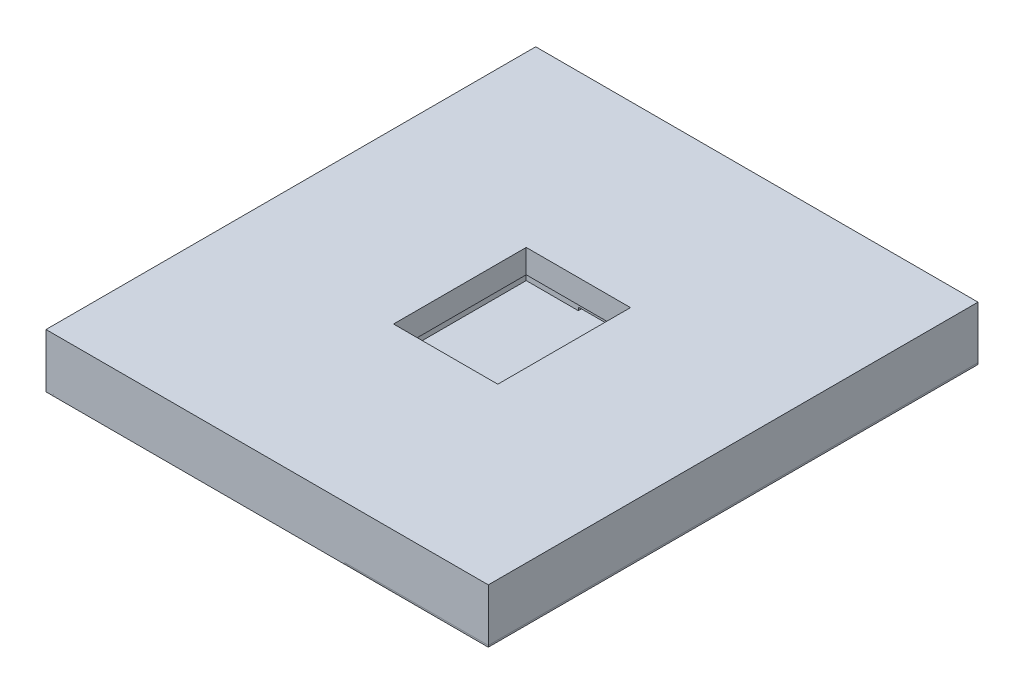
ISO-10303-21;
HEADER;
FILE_DESCRIPTION(('STEP AP214'),'2;1');
FILE_NAME('part.step','',(''),(''),'','','');
FILE_SCHEMA(('AUTOMOTIVE_DESIGN { 1 0 10303 214 1 1 1 1 }'));
ENDSEC;
DATA;
#1=APPLICATION_CONTEXT('core data for automotive mechanical design processes');
#2=APPLICATION_PROTOCOL_DEFINITION('international standard','automotive_design',2000,#1);
#3=PRODUCT_CONTEXT('',#1,'mechanical');
#4=PRODUCT('Part','Part','',(#3));
#5=PRODUCT_RELATED_PRODUCT_CATEGORY('part','',(#4));
#6=PRODUCT_DEFINITION_FORMATION('','',#4);
#7=PRODUCT_DEFINITION_CONTEXT('part definition',#1,'design');
#8=PRODUCT_DEFINITION('design','',#6,#7);
#9=PRODUCT_DEFINITION_SHAPE('','',#8);
#10=(LENGTH_UNIT() NAMED_UNIT(*) SI_UNIT(.MILLI.,.METRE.));
#11=(NAMED_UNIT(*) PLANE_ANGLE_UNIT() SI_UNIT($,.RADIAN.));
#12=(NAMED_UNIT(*) SI_UNIT($,.STERADIAN.) SOLID_ANGLE_UNIT());
#13=UNCERTAINTY_MEASURE_WITH_UNIT(LENGTH_MEASURE(1.E-05),#10,'distance_accuracy_value','');
#14=(GEOMETRIC_REPRESENTATION_CONTEXT(3) GLOBAL_UNCERTAINTY_ASSIGNED_CONTEXT((#13)) GLOBAL_UNIT_ASSIGNED_CONTEXT((#10,
#11,#12)) REPRESENTATION_CONTEXT('',''));
#15=CARTESIAN_POINT('',(0.,0.,0.));
#16=DIRECTION('',(0.,0.,1.));
#17=DIRECTION('',(1.,0.,0.));
#18=AXIS2_PLACEMENT_3D('',#15,#16,#17);
#19=CARTESIAN_POINT('',(0.,6.49,0.));
#20=DIRECTION('',(0.,1.,0.));
#21=DIRECTION('',(0.,0.,1.));
#22=AXIS2_PLACEMENT_3D('',#19,#20,#21);
#23=PLANE('',#22);
#24=DIRECTION('',(0.,0.,1.));
#25=VECTOR('',#24,1.);
#26=CARTESIAN_POINT('',(8.,6.49,-32.3));
#27=LINE('',#26,#25);
#28=CARTESIAN_POINT('',(8.,6.49,-26.5));
#29=VERTEX_POINT('',#28);
#30=CARTESIAN_POINT('',(8.,6.49,-25.));
#31=VERTEX_POINT('',#30);
#32=EDGE_CURVE('E607',#29,#31,#27,.T.);
#33=ORIENTED_EDGE('',*,*,#32,.T.);
#34=DIRECTION('',(1.,0.,0.));
#35=VECTOR('',#34,1.);
#36=CARTESIAN_POINT('',(0.,6.49,-25.));
#37=LINE('',#36,#35);
#38=CARTESIAN_POINT('',(-3.,6.49,-25.));
#39=VERTEX_POINT('',#38);
#40=EDGE_CURVE('E400',#39,#31,#37,.T.);
#41=ORIENTED_EDGE('',*,*,#40,.F.);
#42=DIRECTION('',(0.,0.,1.));
#43=VECTOR('',#42,1.);
#44=CARTESIAN_POINT('',(-3.,6.49,0.));
#45=LINE('',#44,#43);
#46=CARTESIAN_POINT('',(-3.,6.49,3.));
#47=VERTEX_POINT('',#46);
#48=EDGE_CURVE('E395',#39,#47,#45,.T.);
#49=ORIENTED_EDGE('',*,*,#48,.T.);
#50=DIRECTION('',(1.,0.,0.));
#51=VECTOR('',#50,1.);
#52=CARTESIAN_POINT('',(0.,6.49,3.));
#53=LINE('',#52,#51);
#54=CARTESIAN_POINT('',(22.,6.49,3.));
#55=VERTEX_POINT('',#54);
#56=EDGE_CURVE('E405',#47,#55,#53,.T.);
#57=ORIENTED_EDGE('',*,*,#56,.T.);
#58=DIRECTION('',(0.,0.,1.));
#59=VECTOR('',#58,1.);
#60=CARTESIAN_POINT('',(22.,6.49,0.));
#61=LINE('',#60,#59);
#62=CARTESIAN_POINT('',(22.,6.49,-25.));
#63=VERTEX_POINT('',#62);
#64=EDGE_CURVE('E387',#63,#55,#61,.T.);
#65=ORIENTED_EDGE('',*,*,#64,.F.);
#66=CARTESIAN_POINT('',(11.,6.49,-25.));
#67=VERTEX_POINT('',#66);
#68=EDGE_CURVE('E296',#67,#63,#37,.T.);
#69=ORIENTED_EDGE('',*,*,#68,.F.);
#70=DIRECTION('',(0.,0.,1.));
#71=VECTOR('',#70,1.);
#72=CARTESIAN_POINT('',(11.,6.49,-32.3));
#73=LINE('',#72,#71);
#74=CARTESIAN_POINT('',(11.,6.49,-26.5));
#75=VERTEX_POINT('',#74);
#76=EDGE_CURVE('E281',#75,#67,#73,.T.);
#77=ORIENTED_EDGE('',*,*,#76,.F.);
#78=DIRECTION('',(1.,0.,0.));
#79=VECTOR('',#78,1.);
#80=CARTESIAN_POINT('',(0.,6.49,-26.5));
#81=LINE('',#80,#79);
#82=CARTESIAN_POINT('',(23.5,6.49,-26.5));
#83=VERTEX_POINT('',#82);
#84=EDGE_CURVE('E293',#75,#83,#81,.T.);
#85=ORIENTED_EDGE('',*,*,#84,.T.);
#86=DIRECTION('',(0.,0.,1.));
#87=VECTOR('',#86,1.);
#88=CARTESIAN_POINT('',(23.5,6.49,0.));
#89=LINE('',#88,#87);
#90=CARTESIAN_POINT('',(23.5,6.49,4.5));
#91=VERTEX_POINT('',#90);
#92=EDGE_CURVE('E305',#83,#91,#89,.T.);
#93=ORIENTED_EDGE('',*,*,#92,.T.);
#94=DIRECTION('',(1.,0.,0.));
#95=VECTOR('',#94,1.);
#96=CARTESIAN_POINT('',(0.,6.49,4.50000000000001));
#97=LINE('',#96,#95);
#98=CARTESIAN_POINT('',(-4.5,6.49,4.50000000000001));
#99=VERTEX_POINT('',#98);
#100=EDGE_CURVE('E315',#99,#91,#97,.T.);
#101=ORIENTED_EDGE('',*,*,#100,.F.);
#102=DIRECTION('',(0.,0.,1.));
#103=VECTOR('',#102,1.);
#104=CARTESIAN_POINT('',(-4.5,6.49,0.));
#105=LINE('',#104,#103);
#106=CARTESIAN_POINT('',(-4.50000000000001,6.49,-26.5));
#107=VERTEX_POINT('',#106);
#108=EDGE_CURVE('E308',#107,#99,#105,.T.);
#109=ORIENTED_EDGE('',*,*,#108,.F.);
#110=EDGE_CURVE('E304',#107,#29,#81,.T.);
#111=ORIENTED_EDGE('',*,*,#110,.T.);
#112=EDGE_LOOP('',(#33,#41,#49,#57,#65,#69,#77,#85,#93,#101,#109,#111));
#113=FACE_BOUND('',#112,.T.);
#114=ADVANCED_FACE('F95',(#113),#23,.F.);
#115=CARTESIAN_POINT('',(0.,51.6831971484109,-26.5));
#116=DIRECTION('',(0.,0.,-1.));
#117=DIRECTION('',(-1.,0.,0.));
#118=AXIS2_PLACEMENT_3D('',#115,#116,#117);
#119=PLANE('',#118);
#120=DIRECTION('',(1.,0.,0.));
#121=VECTOR('',#120,1.);
#122=CARTESIAN_POINT('',(0.,6.79,-26.5));
#123=LINE('',#122,#121);
#124=CARTESIAN_POINT('',(8.,6.79,-26.5));
#125=VERTEX_POINT('',#124);
#126=CARTESIAN_POINT('',(11.,6.79,-26.5));
#127=VERTEX_POINT('',#126);
#128=EDGE_CURVE('E466',#125,#127,#123,.T.);
#129=ORIENTED_EDGE('',*,*,#128,.F.);
#130=DIRECTION('',(0.,-1.,0.));
#131=VECTOR('',#130,1.);
#132=CARTESIAN_POINT('',(8.,51.6831971484109,-26.5));
#133=LINE('',#132,#131);
#134=EDGE_CURVE('E465',#125,#29,#133,.T.);
#135=ORIENTED_EDGE('',*,*,#134,.T.);
#136=ORIENTED_EDGE('',*,*,#110,.F.);
#137=DIRECTION('',(0.,-1.,0.));
#138=VECTOR('',#137,1.);
#139=CARTESIAN_POINT('',(-4.50000000000001,51.6831971484109,-26.5));
#140=LINE('',#139,#138);
#141=CARTESIAN_POINT('',(-4.50000000000001,9.91,-26.5));
#142=VERTEX_POINT('',#141);
#143=EDGE_CURVE('E322',#142,#107,#140,.T.);
#144=ORIENTED_EDGE('',*,*,#143,.F.);
#145=DIRECTION('',(1.,0.,0.));
#146=VECTOR('',#145,1.);
#147=CARTESIAN_POINT('',(0.,9.91,-26.5));
#148=LINE('',#147,#146);
#149=CARTESIAN_POINT('',(23.5,9.91,-26.5));
#150=VERTEX_POINT('',#149);
#151=EDGE_CURVE('E448',#142,#150,#148,.T.);
#152=ORIENTED_EDGE('',*,*,#151,.T.);
#153=DIRECTION('',(0.,-1.,0.));
#154=VECTOR('',#153,1.);
#155=CARTESIAN_POINT('',(23.5,51.6831971484109,-26.5));
#156=LINE('',#155,#154);
#157=EDGE_CURVE('E302',#150,#83,#156,.T.);
#158=ORIENTED_EDGE('',*,*,#157,.T.);
#159=ORIENTED_EDGE('',*,*,#84,.F.);
#160=DIRECTION('',(0.,-1.,0.));
#161=VECTOR('',#160,1.);
#162=CARTESIAN_POINT('',(11.,51.6831971484109,-26.5));
#163=LINE('',#162,#161);
#164=EDGE_CURVE('E278',#127,#75,#163,.T.);
#165=ORIENTED_EDGE('',*,*,#164,.F.);
#166=EDGE_LOOP('',(#129,#135,#136,#144,#152,#158,#159,#165));
#167=FACE_BOUND('',#166,.T.);
#168=ADVANCED_FACE('F300',(#167),#119,.T.);
#169=CARTESIAN_POINT('',(0.,45.9466487582469,-25.));
#170=DIRECTION('',(0.,0.,-1.));
#171=DIRECTION('',(-1.,0.,0.));
#172=AXIS2_PLACEMENT_3D('',#169,#170,#171);
#173=PLANE('',#172);
#174=DIRECTION('',(0.,-1.,0.));
#175=VECTOR('',#174,1.);
#176=CARTESIAN_POINT('',(8.,45.9466487582469,-25.));
#177=LINE('',#176,#175);
#178=CARTESIAN_POINT('',(8.,6.79,-25.));
#179=VERTEX_POINT('',#178);
#180=EDGE_CURVE('E470',#179,#31,#177,.T.);
#181=ORIENTED_EDGE('',*,*,#180,.F.);
#182=DIRECTION('',(1.,0.,0.));
#183=VECTOR('',#182,1.);
#184=CARTESIAN_POINT('',(0.,6.79,-25.));
#185=LINE('',#184,#183);
#186=CARTESIAN_POINT('',(11.,6.79,-25.));
#187=VERTEX_POINT('',#186);
#188=EDGE_CURVE('E615',#179,#187,#185,.T.);
#189=ORIENTED_EDGE('',*,*,#188,.T.);
#190=DIRECTION('',(0.,-1.,0.));
#191=VECTOR('',#190,1.);
#192=CARTESIAN_POINT('',(11.,45.9466487582469,-25.));
#193=LINE('',#192,#191);
#194=EDGE_CURVE('E287',#187,#67,#193,.T.);
#195=ORIENTED_EDGE('',*,*,#194,.T.);
#196=ORIENTED_EDGE('',*,*,#68,.T.);
#197=DIRECTION('',(0.,-1.,0.));
#198=VECTOR('',#197,1.);
#199=CARTESIAN_POINT('',(22.,45.9466487582469,-25.));
#200=LINE('',#199,#198);
#201=CARTESIAN_POINT('',(22.,8.41000000000001,-25.));
#202=VERTEX_POINT('',#201);
#203=EDGE_CURVE('E412',#202,#63,#200,.T.);
#204=ORIENTED_EDGE('',*,*,#203,.F.);
#205=DIRECTION('',(1.,0.,0.));
#206=VECTOR('',#205,1.);
#207=CARTESIAN_POINT('',(0.,8.41,-25.));
#208=LINE('',#207,#206);
#209=CARTESIAN_POINT('',(-3.,8.41000000000001,-25.));
#210=VERTEX_POINT('',#209);
#211=EDGE_CURVE('E410',#210,#202,#208,.T.);
#212=ORIENTED_EDGE('',*,*,#211,.F.);
#213=DIRECTION('',(0.,-1.,0.));
#214=VECTOR('',#213,1.);
#215=CARTESIAN_POINT('',(-3.,45.9466487582469,-25.));
#216=LINE('',#215,#214);
#217=EDGE_CURVE('E399',#210,#39,#216,.T.);
#218=ORIENTED_EDGE('',*,*,#217,.T.);
#219=ORIENTED_EDGE('',*,*,#40,.T.);
#220=EDGE_LOOP('',(#181,#189,#195,#196,#204,#212,#218,#219));
#221=FACE_BOUND('',#220,.T.);
#222=ADVANCED_FACE('F536',(#221),#173,.F.);
#223=CARTESIAN_POINT('',(0.,45.9466487582469,-23.5));
#224=DIRECTION('',(0.,0.,-1.));
#225=DIRECTION('',(-1.,0.,0.));
#226=AXIS2_PLACEMENT_3D('',#223,#224,#225);
#227=PLANE('',#226);
#228=DIRECTION('',(1.,0.,0.));
#229=VECTOR('',#228,1.);
#230=CARTESIAN_POINT('',(0.,6.79,-23.5));
#231=LINE('',#230,#229);
#232=CARTESIAN_POINT('',(8.,6.79,-23.5));
#233=VERTEX_POINT('',#232);
#234=CARTESIAN_POINT('',(11.,6.79,-23.5));
#235=VERTEX_POINT('',#234);
#236=EDGE_CURVE('E613',#233,#235,#231,.T.);
#237=ORIENTED_EDGE('',*,*,#236,.F.);
#238=DIRECTION('',(0.,-1.,0.));
#239=VECTOR('',#238,1.);
#240=CARTESIAN_POINT('',(8.,45.9466487582469,-23.5));
#241=LINE('',#240,#239);
#242=CARTESIAN_POINT('',(8.,6.49,-23.5));
#243=VERTEX_POINT('',#242);
#244=EDGE_CURVE('E286',#233,#243,#241,.T.);
#245=ORIENTED_EDGE('',*,*,#244,.T.);
#246=DIRECTION('',(1.,0.,0.));
#247=VECTOR('',#246,1.);
#248=CARTESIAN_POINT('',(0.,6.49,-23.5));
#249=LINE('',#248,#247);
#250=CARTESIAN_POINT('',(-1.5,6.49,-23.5));
#251=VERTEX_POINT('',#250);
#252=EDGE_CURVE('E379',#251,#243,#249,.T.);
#253=ORIENTED_EDGE('',*,*,#252,.F.);
#254=DIRECTION('',(0.,-1.,0.));
#255=VECTOR('',#254,1.);
#256=CARTESIAN_POINT('',(-1.5,45.9466487582469,-23.5));
#257=LINE('',#256,#255);
#258=CARTESIAN_POINT('',(-1.5,8.41000000000001,-23.5));
#259=VERTEX_POINT('',#258);
#260=EDGE_CURVE('E398',#259,#251,#257,.T.);
#261=ORIENTED_EDGE('',*,*,#260,.F.);
#262=DIRECTION('',(1.,0.,0.));
#263=VECTOR('',#262,1.);
#264=CARTESIAN_POINT('',(0.,8.41,-23.5));
#265=LINE('',#264,#263);
#266=CARTESIAN_POINT('',(20.5,8.41,-23.5));
#267=VERTEX_POINT('',#266);
#268=EDGE_CURVE('E390',#259,#267,#265,.T.);
#269=ORIENTED_EDGE('',*,*,#268,.T.);
#270=DIRECTION('',(0.,-1.,0.));
#271=VECTOR('',#270,1.);
#272=CARTESIAN_POINT('',(20.5,45.9466487582469,-23.5));
#273=LINE('',#272,#271);
#274=CARTESIAN_POINT('',(20.5,6.49,-23.5));
#275=VERTEX_POINT('',#274);
#276=EDGE_CURVE('E364',#267,#275,#273,.T.);
#277=ORIENTED_EDGE('',*,*,#276,.T.);
#278=CARTESIAN_POINT('',(11.,6.49,-23.5));
#279=VERTEX_POINT('',#278);
#280=EDGE_CURVE('E382',#279,#275,#249,.T.);
#281=ORIENTED_EDGE('',*,*,#280,.F.);
#282=DIRECTION('',(0.,-1.,0.));
#283=VECTOR('',#282,1.);
#284=CARTESIAN_POINT('',(11.,45.9466487582469,-23.5));
#285=LINE('',#284,#283);
#286=EDGE_CURVE('E618',#235,#279,#285,.T.);
#287=ORIENTED_EDGE('',*,*,#286,.F.);
#288=EDGE_LOOP('',(#237,#245,#253,#261,#269,#277,#281,#287));
#289=FACE_BOUND('',#288,.T.);
#290=ADVANCED_FACE('F540',(#289),#227,.T.);
#291=CARTESIAN_POINT('',(8.00000000000001,6.49,-16.7));
#292=VERTEX_POINT('',#291);
#293=EDGE_CURVE('E608',#243,#292,#27,.T.);
#294=ORIENTED_EDGE('',*,*,#293,.T.);
#295=DIRECTION('',(1.,0.,0.));
#296=VECTOR('',#295,1.);
#297=CARTESIAN_POINT('',(4.7,6.49,-16.7));
#298=LINE('',#297,#296);
#299=CARTESIAN_POINT('',(4.7,6.49,-16.7));
#300=VERTEX_POINT('',#299);
#301=EDGE_CURVE('E345',#300,#292,#298,.T.);
#302=ORIENTED_EDGE('',*,*,#301,.F.);
#303=DIRECTION('',(0.,0.,1.));
#304=VECTOR('',#303,1.);
#305=CARTESIAN_POINT('',(4.7,6.49,-16.7));
#306=LINE('',#305,#304);
#307=CARTESIAN_POINT('',(4.7,6.49,-5.3));
#308=VERTEX_POINT('',#307);
#309=EDGE_CURVE('E361',#300,#308,#306,.T.);
#310=ORIENTED_EDGE('',*,*,#309,.T.);
#311=DIRECTION('',(1.,0.,0.));
#312=VECTOR('',#311,1.);
#313=CARTESIAN_POINT('',(4.7,6.49,-5.3));
#314=LINE('',#313,#312);
#315=CARTESIAN_POINT('',(14.3,6.49,-5.3));
#316=VERTEX_POINT('',#315);
#317=EDGE_CURVE('E357',#308,#316,#314,.T.);
#318=ORIENTED_EDGE('',*,*,#317,.T.);
#319=DIRECTION('',(0.,0.,1.));
#320=VECTOR('',#319,1.);
#321=CARTESIAN_POINT('',(14.3,6.49,-16.7));
#322=LINE('',#321,#320);
#323=CARTESIAN_POINT('',(14.3,6.49,-16.7));
#324=VERTEX_POINT('',#323);
#325=EDGE_CURVE('E344',#324,#316,#322,.T.);
#326=ORIENTED_EDGE('',*,*,#325,.F.);
#327=CARTESIAN_POINT('',(11.,6.49,-16.7));
#328=VERTEX_POINT('',#327);
#329=EDGE_CURVE('E333',#328,#324,#298,.T.);
#330=ORIENTED_EDGE('',*,*,#329,.F.);
#331=EDGE_CURVE('E298',#279,#328,#73,.T.);
#332=ORIENTED_EDGE('',*,*,#331,.F.);
#333=ORIENTED_EDGE('',*,*,#280,.T.);
#334=DIRECTION('',(0.,0.,1.));
#335=VECTOR('',#334,1.);
#336=CARTESIAN_POINT('',(20.5,6.49,0.));
#337=LINE('',#336,#335);
#338=CARTESIAN_POINT('',(20.5,6.49,1.5));
#339=VERTEX_POINT('',#338);
#340=EDGE_CURVE('E391',#275,#339,#337,.T.);
#341=ORIENTED_EDGE('',*,*,#340,.T.);
#342=DIRECTION('',(1.,0.,0.));
#343=VECTOR('',#342,1.);
#344=CARTESIAN_POINT('',(0.,6.49,1.5));
#345=LINE('',#344,#343);
#346=CARTESIAN_POINT('',(-1.5,6.49,1.5));
#347=VERTEX_POINT('',#346);
#348=EDGE_CURVE('E386',#347,#339,#345,.T.);
#349=ORIENTED_EDGE('',*,*,#348,.F.);
#350=DIRECTION('',(0.,0.,1.));
#351=VECTOR('',#350,1.);
#352=CARTESIAN_POINT('',(-1.5,6.49,0.));
#353=LINE('',#352,#351);
#354=EDGE_CURVE('E383',#251,#347,#353,.T.);
#355=ORIENTED_EDGE('',*,*,#354,.F.);
#356=ORIENTED_EDGE('',*,*,#252,.T.);
#357=EDGE_LOOP('',(#294,#302,#310,#318,#326,#330,#332,#333,#341,#349,#355,#356));
#358=FACE_BOUND('',#357,.T.);
#359=ADVANCED_FACE('F340',(#358),#23,.F.);
#360=CARTESIAN_POINT('',(4.7,23.3136908180491,-16.7));
#361=DIRECTION('',(0.,0.,-1.));
#362=DIRECTION('',(-1.,0.,0.));
#363=AXIS2_PLACEMENT_3D('',#360,#361,#362);
#364=PLANE('',#363);
#365=DIRECTION('',(0.,-1.,0.));
#366=VECTOR('',#365,1.);
#367=CARTESIAN_POINT('',(8.,23.3136908180491,-16.7));
#368=LINE('',#367,#366);
#369=CARTESIAN_POINT('',(8.00000000000001,6.79,-16.7));
#370=VERTEX_POINT('',#369);
#371=EDGE_CURVE('E13',#370,#292,#368,.T.);
#372=ORIENTED_EDGE('',*,*,#371,.F.);
#373=DIRECTION('',(1.,0.,0.));
#374=VECTOR('',#373,1.);
#375=CARTESIAN_POINT('',(4.7,6.79,-16.7));
#376=LINE('',#375,#374);
#377=CARTESIAN_POINT('',(11.,6.79,-16.7));
#378=VERTEX_POINT('',#377);
#379=EDGE_CURVE('E325',#370,#378,#376,.T.);
#380=ORIENTED_EDGE('',*,*,#379,.T.);
#381=DIRECTION('',(0.,-1.,0.));
#382=VECTOR('',#381,1.);
#383=CARTESIAN_POINT('',(11.,23.3136908180491,-16.7));
#384=LINE('',#383,#382);
#385=EDGE_CURVE('E103',#378,#328,#384,.T.);
#386=ORIENTED_EDGE('',*,*,#385,.T.);
#387=ORIENTED_EDGE('',*,*,#329,.T.);
#388=DIRECTION('',(0.,-1.,0.));
#389=VECTOR('',#388,1.);
#390=CARTESIAN_POINT('',(14.3,23.3136908180491,-16.7));
#391=LINE('',#390,#389);
#392=CARTESIAN_POINT('',(14.3,8.41,-16.7));
#393=VERTEX_POINT('',#392);
#394=EDGE_CURVE('E367',#393,#324,#391,.T.);
#395=ORIENTED_EDGE('',*,*,#394,.F.);
#396=DIRECTION('',(1.,0.,0.));
#397=VECTOR('',#396,1.);
#398=CARTESIAN_POINT('',(4.7,8.41,-16.7));
#399=LINE('',#398,#397);
#400=CARTESIAN_POINT('',(4.7,8.41,-16.7));
#401=VERTEX_POINT('',#400);
#402=EDGE_CURVE('E356',#401,#393,#399,.T.);
#403=ORIENTED_EDGE('',*,*,#402,.F.);
#404=DIRECTION('',(0.,-1.,0.));
#405=VECTOR('',#404,1.);
#406=CARTESIAN_POINT('',(4.7,23.3136908180491,-16.7));
#407=LINE('',#406,#405);
#408=EDGE_CURVE('E359',#401,#300,#407,.T.);
#409=ORIENTED_EDGE('',*,*,#408,.T.);
#410=ORIENTED_EDGE('',*,*,#301,.T.);
#411=EDGE_LOOP('',(#372,#380,#386,#387,#395,#403,#409,#410));
#412=FACE_BOUND('',#411,.T.);
#413=ADVANCED_FACE('F331',(#412),#364,.F.);
#414=CARTESIAN_POINT('',(0.,9.91,0.));
#415=DIRECTION('',(0.,1.,0.));
#416=DIRECTION('',(0.,0.,1.));
#417=AXIS2_PLACEMENT_3D('',#414,#415,#416);
#418=PLANE('',#417);
#419=DIRECTION('',(0.,0.,1.));
#420=VECTOR('',#419,1.);
#421=CARTESIAN_POINT('',(23.5,9.91,0.));
#422=LINE('',#421,#420);
#423=CARTESIAN_POINT('',(23.5,9.91,4.5));
#424=VERTEX_POINT('',#423);
#425=EDGE_CURVE('E309',#150,#424,#422,.T.);
#426=ORIENTED_EDGE('',*,*,#425,.F.);
#427=ORIENTED_EDGE('',*,*,#151,.F.);
#428=DIRECTION('',(0.,0.,1.));
#429=VECTOR('',#428,1.);
#430=CARTESIAN_POINT('',(-4.5,9.91,0.));
#431=LINE('',#430,#429);
#432=CARTESIAN_POINT('',(-4.5,9.91,4.50000000000001));
#433=VERTEX_POINT('',#432);
#434=EDGE_CURVE('E445',#142,#433,#431,.T.);
#435=ORIENTED_EDGE('',*,*,#434,.T.);
#436=DIRECTION('',(1.,0.,0.));
#437=VECTOR('',#436,1.);
#438=CARTESIAN_POINT('',(0.,9.91,4.50000000000001));
#439=LINE('',#438,#437);
#440=EDGE_CURVE('E418',#433,#424,#439,.T.);
#441=ORIENTED_EDGE('',*,*,#440,.T.);
#442=EDGE_LOOP('',(#426,#427,#435,#441));
#443=FACE_BOUND('',#442,.T.);
#444=DIRECTION('',(0.,0.,-1.));
#445=VECTOR('',#444,1.);
#446=CARTESIAN_POINT('',(6.2,9.91,0.));
#447=LINE('',#446,#445);
#448=CARTESIAN_POINT('',(6.2,9.91,-6.8));
#449=VERTEX_POINT('',#448);
#450=CARTESIAN_POINT('',(6.2,9.91,-15.2));
#451=VERTEX_POINT('',#450);
#452=EDGE_CURVE('E490',#449,#451,#447,.T.);
#453=ORIENTED_EDGE('',*,*,#452,.T.);
#454=DIRECTION('',(-1.,0.,0.));
#455=VECTOR('',#454,1.);
#456=CARTESIAN_POINT('',(0.,9.91,-15.2));
#457=LINE('',#456,#455);
#458=CARTESIAN_POINT('',(12.8,9.91,-15.2));
#459=VERTEX_POINT('',#458);
#460=EDGE_CURVE('E368',#459,#451,#457,.T.);
#461=ORIENTED_EDGE('',*,*,#460,.F.);
#462=DIRECTION('',(0.,0.,-1.));
#463=VECTOR('',#462,1.);
#464=CARTESIAN_POINT('',(12.8,9.91,0.));
#465=LINE('',#464,#463);
#466=CARTESIAN_POINT('',(12.8,9.91,-6.8));
#467=VERTEX_POINT('',#466);
#468=EDGE_CURVE('E487',#467,#459,#465,.T.);
#469=ORIENTED_EDGE('',*,*,#468,.F.);
#470=DIRECTION('',(-1.,0.,0.));
#471=VECTOR('',#470,1.);
#472=CARTESIAN_POINT('',(0.,9.91,-6.8));
#473=LINE('',#472,#471);
#474=EDGE_CURVE('E491',#467,#449,#473,.T.);
#475=ORIENTED_EDGE('',*,*,#474,.T.);
#476=EDGE_LOOP('',(#453,#461,#469,#475));
#477=FACE_BOUND('',#476,.T.);
#478=ADVANCED_FACE('F455',(#443,#477),#418,.T.);
#479=CARTESIAN_POINT('',(0.,8.41,0.));
#480=DIRECTION('',(0.,1.,0.));
#481=DIRECTION('',(0.,0.,1.));
#482=AXIS2_PLACEMENT_3D('',#479,#480,#481);
#483=PLANE('',#482);
#484=ORIENTED_EDGE('',*,*,#402,.T.);
#485=DIRECTION('',(0.,0.,1.));
#486=VECTOR('',#485,1.);
#487=CARTESIAN_POINT('',(14.3,8.41,-16.7));
#488=LINE('',#487,#486);
#489=CARTESIAN_POINT('',(14.3,8.41,-5.3));
#490=VERTEX_POINT('',#489);
#491=EDGE_CURVE('E370',#393,#490,#488,.T.);
#492=ORIENTED_EDGE('',*,*,#491,.T.);
#493=DIRECTION('',(1.,0.,0.));
#494=VECTOR('',#493,1.);
#495=CARTESIAN_POINT('',(4.7,8.41,-5.3));
#496=LINE('',#495,#494);
#497=CARTESIAN_POINT('',(4.7,8.41,-5.3));
#498=VERTEX_POINT('',#497);
#499=EDGE_CURVE('E346',#498,#490,#496,.T.);
#500=ORIENTED_EDGE('',*,*,#499,.F.);
#501=DIRECTION('',(0.,0.,1.));
#502=VECTOR('',#501,1.);
#503=CARTESIAN_POINT('',(4.7,8.41,-16.7));
#504=LINE('',#503,#502);
#505=EDGE_CURVE('E349',#401,#498,#504,.T.);
#506=ORIENTED_EDGE('',*,*,#505,.F.);
#507=EDGE_LOOP('',(#484,#492,#500,#506));
#508=FACE_BOUND('',#507,.T.);
#509=DIRECTION('',(-1.,0.,0.));
#510=VECTOR('',#509,1.);
#511=CARTESIAN_POINT('',(0.,8.41,-15.2));
#512=LINE('',#511,#510);
#513=CARTESIAN_POINT('',(12.8,8.41,-15.2));
#514=VERTEX_POINT('',#513);
#515=CARTESIAN_POINT('',(6.2,8.41,-15.2));
#516=VERTEX_POINT('',#515);
#517=EDGE_CURVE('E473',#514,#516,#512,.T.);
#518=ORIENTED_EDGE('',*,*,#517,.T.);
#519=DIRECTION('',(0.,0.,-1.));
#520=VECTOR('',#519,1.);
#521=CARTESIAN_POINT('',(6.2,8.41,0.));
#522=LINE('',#521,#520);
#523=CARTESIAN_POINT('',(6.2,8.41,-6.8));
#524=VERTEX_POINT('',#523);
#525=EDGE_CURVE('E484',#524,#516,#522,.T.);
#526=ORIENTED_EDGE('',*,*,#525,.F.);
#527=DIRECTION('',(-1.,0.,0.));
#528=VECTOR('',#527,1.);
#529=CARTESIAN_POINT('',(0.,8.41,-6.8));
#530=LINE('',#529,#528);
#531=CARTESIAN_POINT('',(12.8,8.41,-6.8));
#532=VERTEX_POINT('',#531);
#533=EDGE_CURVE('E480',#532,#524,#530,.T.);
#534=ORIENTED_EDGE('',*,*,#533,.F.);
#535=DIRECTION('',(0.,0.,-1.));
#536=VECTOR('',#535,1.);
#537=CARTESIAN_POINT('',(12.8,8.41,0.));
#538=LINE('',#537,#536);
#539=EDGE_CURVE('E477',#532,#514,#538,.T.);
#540=ORIENTED_EDGE('',*,*,#539,.T.);
#541=EDGE_LOOP('',(#518,#526,#534,#540));
#542=FACE_BOUND('',#541,.T.);
#543=ADVANCED_FACE('F513',(#508,#542),#483,.F.);
#544=CARTESIAN_POINT('',(0.,51.6831971484109,4.50000000000001));
#545=DIRECTION('',(0.,0.,-1.));
#546=DIRECTION('',(-1.,0.,0.));
#547=AXIS2_PLACEMENT_3D('',#544,#545,#546);
#548=PLANE('',#547);
#549=ORIENTED_EDGE('',*,*,#440,.F.);
#550=DIRECTION('',(0.,-1.,0.));
#551=VECTOR('',#550,1.);
#552=CARTESIAN_POINT('',(-4.5,51.6831971484109,4.50000000000001));
#553=LINE('',#552,#551);
#554=EDGE_CURVE('E320',#433,#99,#553,.T.);
#555=ORIENTED_EDGE('',*,*,#554,.T.);
#556=ORIENTED_EDGE('',*,*,#100,.T.);
#557=DIRECTION('',(0.,-1.,0.));
#558=VECTOR('',#557,1.);
#559=CARTESIAN_POINT('',(23.5,51.6831971484109,4.5));
#560=LINE('',#559,#558);
#561=EDGE_CURVE('E318',#424,#91,#560,.T.);
#562=ORIENTED_EDGE('',*,*,#561,.F.);
#563=EDGE_LOOP('',(#549,#555,#556,#562));
#564=FACE_BOUND('',#563,.T.);
#565=ADVANCED_FACE('F458',(#564),#548,.F.);
#566=CARTESIAN_POINT('',(-4.5,51.6831971484109,0.));
#567=DIRECTION('',(1.,0.,0.));
#568=DIRECTION('',(0.,0.,-1.));
#569=AXIS2_PLACEMENT_3D('',#566,#567,#568);
#570=PLANE('',#569);
#571=ORIENTED_EDGE('',*,*,#434,.F.);
#572=ORIENTED_EDGE('',*,*,#143,.T.);
#573=ORIENTED_EDGE('',*,*,#108,.T.);
#574=ORIENTED_EDGE('',*,*,#554,.F.);
#575=EDGE_LOOP('',(#571,#572,#573,#574));
#576=FACE_BOUND('',#575,.T.);
#577=ADVANCED_FACE('F584',(#576),#570,.F.);
#578=CARTESIAN_POINT('',(23.5,51.6831971484109,0.));
#579=DIRECTION('',(1.,0.,0.));
#580=DIRECTION('',(0.,0.,-1.));
#581=AXIS2_PLACEMENT_3D('',#578,#579,#580);
#582=PLANE('',#581);
#583=ORIENTED_EDGE('',*,*,#157,.F.);
#584=ORIENTED_EDGE('',*,*,#425,.T.);
#585=ORIENTED_EDGE('',*,*,#561,.T.);
#586=ORIENTED_EDGE('',*,*,#92,.F.);
#587=EDGE_LOOP('',(#583,#584,#585,#586));
#588=FACE_BOUND('',#587,.T.);
#589=ADVANCED_FACE('F97',(#588),#582,.T.);
#590=CARTESIAN_POINT('',(20.5,45.9466487582469,0.));
#591=DIRECTION('',(1.,0.,0.));
#592=DIRECTION('',(0.,0.,-1.));
#593=AXIS2_PLACEMENT_3D('',#590,#591,#592);
#594=PLANE('',#593);
#595=DIRECTION('',(0.,0.,1.));
#596=VECTOR('',#595,1.);
#597=CARTESIAN_POINT('',(20.5,8.41,0.));
#598=LINE('',#597,#596);
#599=CARTESIAN_POINT('',(20.5,8.41000000000001,1.5));
#600=VERTEX_POINT('',#599);
#601=EDGE_CURVE('E425',#267,#600,#598,.T.);
#602=ORIENTED_EDGE('',*,*,#601,.T.);
#603=DIRECTION('',(0.,-1.,0.));
#604=VECTOR('',#603,1.);
#605=CARTESIAN_POINT('',(20.5,45.9466487582469,1.5));
#606=LINE('',#605,#604);
#607=EDGE_CURVE('E423',#600,#339,#606,.T.);
#608=ORIENTED_EDGE('',*,*,#607,.T.);
#609=ORIENTED_EDGE('',*,*,#340,.F.);
#610=ORIENTED_EDGE('',*,*,#276,.F.);
#611=EDGE_LOOP('',(#602,#608,#609,#610));
#612=FACE_BOUND('',#611,.T.);
#613=ADVANCED_FACE('F565',(#612),#594,.T.);
#614=CARTESIAN_POINT('',(0.,45.9466487582469,1.5));
#615=DIRECTION('',(0.,0.,-1.));
#616=DIRECTION('',(-1.,0.,0.));
#617=AXIS2_PLACEMENT_3D('',#614,#615,#616);
#618=PLANE('',#617);
#619=DIRECTION('',(0.,-1.,0.));
#620=VECTOR('',#619,1.);
#621=CARTESIAN_POINT('',(-1.5,45.9466487582469,1.5));
#622=LINE('',#621,#620);
#623=CARTESIAN_POINT('',(-1.5,8.41000000000001,1.5));
#624=VERTEX_POINT('',#623);
#625=EDGE_CURVE('E422',#624,#347,#622,.T.);
#626=ORIENTED_EDGE('',*,*,#625,.T.);
#627=ORIENTED_EDGE('',*,*,#348,.T.);
#628=ORIENTED_EDGE('',*,*,#607,.F.);
#629=DIRECTION('',(1.,0.,0.));
#630=VECTOR('',#629,1.);
#631=CARTESIAN_POINT('',(0.,8.41,1.5));
#632=LINE('',#631,#630);
#633=EDGE_CURVE('E394',#624,#600,#632,.T.);
#634=ORIENTED_EDGE('',*,*,#633,.F.);
#635=EDGE_LOOP('',(#626,#627,#628,#634));
#636=FACE_BOUND('',#635,.T.);
#637=ADVANCED_FACE('F561',(#636),#618,.F.);
#638=CARTESIAN_POINT('',(-1.5,45.9466487582469,0.));
#639=DIRECTION('',(1.,0.,0.));
#640=DIRECTION('',(0.,0.,-1.));
#641=AXIS2_PLACEMENT_3D('',#638,#639,#640);
#642=PLANE('',#641);
#643=ORIENTED_EDGE('',*,*,#260,.T.);
#644=ORIENTED_EDGE('',*,*,#354,.T.);
#645=ORIENTED_EDGE('',*,*,#625,.F.);
#646=DIRECTION('',(0.,0.,1.));
#647=VECTOR('',#646,1.);
#648=CARTESIAN_POINT('',(-1.5,8.41,0.));
#649=LINE('',#648,#647);
#650=EDGE_CURVE('E420',#259,#624,#649,.T.);
#651=ORIENTED_EDGE('',*,*,#650,.F.);
#652=EDGE_LOOP('',(#643,#644,#645,#651));
#653=FACE_BOUND('',#652,.T.);
#654=ADVANCED_FACE('F558',(#653),#642,.F.);
#655=CARTESIAN_POINT('',(0.,45.9466487582469,3.));
#656=DIRECTION('',(0.,0.,-1.));
#657=DIRECTION('',(-1.,0.,0.));
#658=AXIS2_PLACEMENT_3D('',#655,#656,#657);
#659=PLANE('',#658);
#660=DIRECTION('',(1.,0.,0.));
#661=VECTOR('',#660,1.);
#662=CARTESIAN_POINT('',(0.,8.41,3.));
#663=LINE('',#662,#661);
#664=CARTESIAN_POINT('',(-3.,8.41,3.));
#665=VERTEX_POINT('',#664);
#666=CARTESIAN_POINT('',(22.,8.41000000000001,3.));
#667=VERTEX_POINT('',#666);
#668=EDGE_CURVE('E415',#665,#667,#663,.T.);
#669=ORIENTED_EDGE('',*,*,#668,.T.);
#670=DIRECTION('',(0.,-1.,0.));
#671=VECTOR('',#670,1.);
#672=CARTESIAN_POINT('',(22.,45.9466487582469,3.));
#673=LINE('',#672,#671);
#674=EDGE_CURVE('E413',#667,#55,#673,.T.);
#675=ORIENTED_EDGE('',*,*,#674,.T.);
#676=ORIENTED_EDGE('',*,*,#56,.F.);
#677=DIRECTION('',(0.,-1.,0.));
#678=VECTOR('',#677,1.);
#679=CARTESIAN_POINT('',(-3.,45.9466487582469,3.));
#680=LINE('',#679,#678);
#681=EDGE_CURVE('E409',#665,#47,#680,.T.);
#682=ORIENTED_EDGE('',*,*,#681,.F.);
#683=EDGE_LOOP('',(#669,#675,#676,#682));
#684=FACE_BOUND('',#683,.T.);
#685=ADVANCED_FACE('F556',(#684),#659,.T.);
#686=CARTESIAN_POINT('',(22.,45.9466487582469,0.));
#687=DIRECTION('',(1.,0.,0.));
#688=DIRECTION('',(0.,0.,-1.));
#689=AXIS2_PLACEMENT_3D('',#686,#687,#688);
#690=PLANE('',#689);
#691=ORIENTED_EDGE('',*,*,#203,.T.);
#692=ORIENTED_EDGE('',*,*,#64,.T.);
#693=ORIENTED_EDGE('',*,*,#674,.F.);
#694=DIRECTION('',(0.,0.,1.));
#695=VECTOR('',#694,1.);
#696=CARTESIAN_POINT('',(22.,8.41,0.));
#697=LINE('',#696,#695);
#698=EDGE_CURVE('E408',#202,#667,#697,.T.);
#699=ORIENTED_EDGE('',*,*,#698,.F.);
#700=EDGE_LOOP('',(#691,#692,#693,#699));
#701=FACE_BOUND('',#700,.T.);
#702=ADVANCED_FACE('F588',(#701),#690,.F.);
#703=CARTESIAN_POINT('',(-3.,45.9466487582469,0.));
#704=DIRECTION('',(1.,0.,0.));
#705=DIRECTION('',(0.,0.,-1.));
#706=AXIS2_PLACEMENT_3D('',#703,#704,#705);
#707=PLANE('',#706);
#708=DIRECTION('',(0.,0.,1.));
#709=VECTOR('',#708,1.);
#710=CARTESIAN_POINT('',(-3.,8.41,0.));
#711=LINE('',#710,#709);
#712=EDGE_CURVE('E419',#210,#665,#711,.T.);
#713=ORIENTED_EDGE('',*,*,#712,.T.);
#714=ORIENTED_EDGE('',*,*,#681,.T.);
#715=ORIENTED_EDGE('',*,*,#48,.F.);
#716=ORIENTED_EDGE('',*,*,#217,.F.);
#717=EDGE_LOOP('',(#713,#714,#715,#716));
#718=FACE_BOUND('',#717,.T.);
#719=ADVANCED_FACE('F573',(#718),#707,.T.);
#720=CARTESIAN_POINT('',(0.,8.41,0.));
#721=DIRECTION('',(0.,1.,0.));
#722=DIRECTION('',(0.,0.,1.));
#723=AXIS2_PLACEMENT_3D('',#720,#721,#722);
#724=PLANE('',#723);
#725=ORIENTED_EDGE('',*,*,#268,.F.);
#726=ORIENTED_EDGE('',*,*,#650,.T.);
#727=ORIENTED_EDGE('',*,*,#633,.T.);
#728=ORIENTED_EDGE('',*,*,#601,.F.);
#729=EDGE_LOOP('',(#725,#726,#727,#728));
#730=FACE_BOUND('',#729,.T.);
#731=ORIENTED_EDGE('',*,*,#712,.F.);
#732=ORIENTED_EDGE('',*,*,#211,.T.);
#733=ORIENTED_EDGE('',*,*,#698,.T.);
#734=ORIENTED_EDGE('',*,*,#668,.F.);
#735=EDGE_LOOP('',(#731,#732,#733,#734));
#736=FACE_BOUND('',#735,.T.);
#737=ADVANCED_FACE('F570',(#730,#736),#724,.F.);
#738=CARTESIAN_POINT('',(14.3,23.3136908180491,-16.7));
#739=DIRECTION('',(1.,0.,0.));
#740=DIRECTION('',(0.,0.,-1.));
#741=AXIS2_PLACEMENT_3D('',#738,#739,#740);
#742=PLANE('',#741);
#743=ORIENTED_EDGE('',*,*,#394,.T.);
#744=ORIENTED_EDGE('',*,*,#325,.T.);
#745=DIRECTION('',(0.,-1.,0.));
#746=VECTOR('',#745,1.);
#747=CARTESIAN_POINT('',(14.3,23.3136908180491,-5.3));
#748=LINE('',#747,#746);
#749=EDGE_CURVE('E373',#490,#316,#748,.T.);
#750=ORIENTED_EDGE('',*,*,#749,.F.);
#751=ORIENTED_EDGE('',*,*,#491,.F.);
#752=EDGE_LOOP('',(#743,#744,#750,#751));
#753=FACE_BOUND('',#752,.T.);
#754=ADVANCED_FACE('F572',(#753),#742,.F.);
#755=CARTESIAN_POINT('',(4.7,23.3136908180491,-5.3));
#756=DIRECTION('',(0.,0.,-1.));
#757=DIRECTION('',(-1.,0.,0.));
#758=AXIS2_PLACEMENT_3D('',#755,#756,#757);
#759=PLANE('',#758);
#760=ORIENTED_EDGE('',*,*,#499,.T.);
#761=ORIENTED_EDGE('',*,*,#749,.T.);
#762=ORIENTED_EDGE('',*,*,#317,.F.);
#763=DIRECTION('',(0.,-1.,0.));
#764=VECTOR('',#763,1.);
#765=CARTESIAN_POINT('',(4.7,23.3136908180491,-5.3));
#766=LINE('',#765,#764);
#767=EDGE_CURVE('E360',#498,#308,#766,.T.);
#768=ORIENTED_EDGE('',*,*,#767,.F.);
#769=EDGE_LOOP('',(#760,#761,#762,#768));
#770=FACE_BOUND('',#769,.T.);
#771=ADVANCED_FACE('F528',(#770),#759,.T.);
#772=CARTESIAN_POINT('',(4.7,23.3136908180491,-16.7));
#773=DIRECTION('',(1.,0.,0.));
#774=DIRECTION('',(0.,0.,-1.));
#775=AXIS2_PLACEMENT_3D('',#772,#773,#774);
#776=PLANE('',#775);
#777=ORIENTED_EDGE('',*,*,#505,.T.);
#778=ORIENTED_EDGE('',*,*,#767,.T.);
#779=ORIENTED_EDGE('',*,*,#309,.F.);
#780=ORIENTED_EDGE('',*,*,#408,.F.);
#781=EDGE_LOOP('',(#777,#778,#779,#780));
#782=FACE_BOUND('',#781,.T.);
#783=ADVANCED_FACE('F521',(#782),#776,.T.);
#784=CARTESIAN_POINT('',(0.,20.5926962888589,-15.2));
#785=DIRECTION('',(0.,0.,1.));
#786=DIRECTION('',(1.,0.,0.));
#787=AXIS2_PLACEMENT_3D('',#784,#785,#786);
#788=PLANE('',#787);
#789=ORIENTED_EDGE('',*,*,#460,.T.);
#790=DIRECTION('',(0.,-1.,0.));
#791=VECTOR('',#790,1.);
#792=CARTESIAN_POINT('',(6.2,20.5926962888589,-15.2));
#793=LINE('',#792,#791);
#794=EDGE_CURVE('E495',#451,#516,#793,.T.);
#795=ORIENTED_EDGE('',*,*,#794,.T.);
#796=ORIENTED_EDGE('',*,*,#517,.F.);
#797=DIRECTION('',(0.,-1.,0.));
#798=VECTOR('',#797,1.);
#799=CARTESIAN_POINT('',(12.8,20.5926962888589,-15.2));
#800=LINE('',#799,#798);
#801=EDGE_CURVE('E353',#459,#514,#800,.T.);
#802=ORIENTED_EDGE('',*,*,#801,.F.);
#803=EDGE_LOOP('',(#789,#795,#796,#802));
#804=FACE_BOUND('',#803,.T.);
#805=ADVANCED_FACE('F519',(#804),#788,.T.);
#806=CARTESIAN_POINT('',(6.2,20.5926962888589,0.));
#807=DIRECTION('',(-1.,0.,0.));
#808=DIRECTION('',(0.,0.,1.));
#809=AXIS2_PLACEMENT_3D('',#806,#807,#808);
#810=PLANE('',#809);
#811=DIRECTION('',(0.,-1.,0.));
#812=VECTOR('',#811,1.);
#813=CARTESIAN_POINT('',(6.2,20.5926962888589,-6.8));
#814=LINE('',#813,#812);
#815=EDGE_CURVE('E494',#449,#524,#814,.T.);
#816=ORIENTED_EDGE('',*,*,#815,.T.);
#817=ORIENTED_EDGE('',*,*,#525,.T.);
#818=ORIENTED_EDGE('',*,*,#794,.F.);
#819=ORIENTED_EDGE('',*,*,#452,.F.);
#820=EDGE_LOOP('',(#816,#817,#818,#819));
#821=FACE_BOUND('',#820,.T.);
#822=ADVANCED_FACE('F515',(#821),#810,.F.);
#823=CARTESIAN_POINT('',(0.,20.5926962888589,-6.8));
#824=DIRECTION('',(0.,0.,1.));
#825=DIRECTION('',(1.,0.,0.));
#826=AXIS2_PLACEMENT_3D('',#823,#824,#825);
#827=PLANE('',#826);
#828=DIRECTION('',(0.,-1.,0.));
#829=VECTOR('',#828,1.);
#830=CARTESIAN_POINT('',(12.8,20.5926962888589,-6.8));
#831=LINE('',#830,#829);
#832=EDGE_CURVE('E481',#467,#532,#831,.T.);
#833=ORIENTED_EDGE('',*,*,#832,.T.);
#834=ORIENTED_EDGE('',*,*,#533,.T.);
#835=ORIENTED_EDGE('',*,*,#815,.F.);
#836=ORIENTED_EDGE('',*,*,#474,.F.);
#837=EDGE_LOOP('',(#833,#834,#835,#836));
#838=FACE_BOUND('',#837,.T.);
#839=ADVANCED_FACE('F506',(#838),#827,.F.);
#840=CARTESIAN_POINT('',(12.8,20.5926962888589,0.));
#841=DIRECTION('',(-1.,0.,0.));
#842=DIRECTION('',(0.,0.,1.));
#843=AXIS2_PLACEMENT_3D('',#840,#841,#842);
#844=PLANE('',#843);
#845=ORIENTED_EDGE('',*,*,#468,.T.);
#846=ORIENTED_EDGE('',*,*,#801,.T.);
#847=ORIENTED_EDGE('',*,*,#539,.F.);
#848=ORIENTED_EDGE('',*,*,#832,.F.);
#849=EDGE_LOOP('',(#845,#846,#847,#848));
#850=FACE_BOUND('',#849,.T.);
#851=ADVANCED_FACE('F511',(#850),#844,.T.);
#852=CARTESIAN_POINT('',(0.,6.79,0.));
#853=DIRECTION('',(0.,1.,0.));
#854=DIRECTION('',(0.,0.,1.));
#855=AXIS2_PLACEMENT_3D('',#852,#853,#854);
#856=PLANE('',#855);
#857=ORIENTED_EDGE('',*,*,#236,.T.);
#858=DIRECTION('',(0.,0.,1.));
#859=VECTOR('',#858,1.);
#860=CARTESIAN_POINT('',(11.,6.79,-32.3));
#861=LINE('',#860,#859);
#862=EDGE_CURVE('E118',#235,#378,#861,.T.);
#863=ORIENTED_EDGE('',*,*,#862,.T.);
#864=ORIENTED_EDGE('',*,*,#379,.F.);
#865=DIRECTION('',(0.,0.,1.));
#866=VECTOR('',#865,1.);
#867=CARTESIAN_POINT('',(8.,6.79,-32.3));
#868=LINE('',#867,#866);
#869=EDGE_CURVE('E297',#233,#370,#868,.T.);
#870=ORIENTED_EDGE('',*,*,#869,.F.);
#871=EDGE_LOOP('',(#857,#863,#864,#870));
#872=FACE_BOUND('',#871,.T.);
#873=ADVANCED_FACE('F693',(#872),#856,.F.);
#874=CARTESIAN_POINT('',(11.,6.79,-32.3));
#875=DIRECTION('',(1.,0.,0.));
#876=DIRECTION('',(0.,0.,-1.));
#877=AXIS2_PLACEMENT_3D('',#874,#875,#876);
#878=PLANE('',#877);
#879=ORIENTED_EDGE('',*,*,#286,.T.);
#880=ORIENTED_EDGE('',*,*,#331,.T.);
#881=ORIENTED_EDGE('',*,*,#385,.F.);
#882=ORIENTED_EDGE('',*,*,#862,.F.);
#883=EDGE_LOOP('',(#879,#880,#881,#882));
#884=FACE_BOUND('',#883,.T.);
#885=ADVANCED_FACE('F636',(#884),#878,.F.);
#886=CARTESIAN_POINT('',(8.,6.79,-32.3));
#887=DIRECTION('',(1.,0.,0.));
#888=DIRECTION('',(0.,0.,-1.));
#889=AXIS2_PLACEMENT_3D('',#886,#887,#888);
#890=PLANE('',#889);
#891=ORIENTED_EDGE('',*,*,#869,.T.);
#892=ORIENTED_EDGE('',*,*,#371,.T.);
#893=ORIENTED_EDGE('',*,*,#293,.F.);
#894=ORIENTED_EDGE('',*,*,#244,.F.);
#895=EDGE_LOOP('',(#891,#892,#893,#894));
#896=FACE_BOUND('',#895,.T.);
#897=ADVANCED_FACE('F638',(#896),#890,.T.);
#898=EDGE_CURVE('E637',#125,#179,#868,.T.);
#899=ORIENTED_EDGE('',*,*,#898,.T.);
#900=ORIENTED_EDGE('',*,*,#180,.T.);
#901=ORIENTED_EDGE('',*,*,#32,.F.);
#902=ORIENTED_EDGE('',*,*,#134,.F.);
#903=EDGE_LOOP('',(#899,#900,#901,#902));
#904=FACE_BOUND('',#903,.T.);
#905=ADVANCED_FACE('F756',(#904),#890,.T.);
#906=ORIENTED_EDGE('',*,*,#164,.T.);
#907=ORIENTED_EDGE('',*,*,#76,.T.);
#908=ORIENTED_EDGE('',*,*,#194,.F.);
#909=EDGE_CURVE('E110',#127,#187,#861,.T.);
#910=ORIENTED_EDGE('',*,*,#909,.F.);
#911=EDGE_LOOP('',(#906,#907,#908,#910));
#912=FACE_BOUND('',#911,.T.);
#913=ADVANCED_FACE('F280',(#912),#878,.F.);
#914=ORIENTED_EDGE('',*,*,#128,.T.);
#915=ORIENTED_EDGE('',*,*,#909,.T.);
#916=ORIENTED_EDGE('',*,*,#188,.F.);
#917=ORIENTED_EDGE('',*,*,#898,.F.);
#918=EDGE_LOOP('',(#914,#915,#916,#917));
#919=FACE_BOUND('',#918,.T.);
#920=ADVANCED_FACE('F740',(#919),#856,.F.);
#921=CLOSED_SHELL('',(#114,#168,#222,#290,#359,#413,#478,#543,#565,#577,#589,#613,#637,#654,
#685,#702,#719,#737,#754,#771,#783,#805,#822,#839,#851,#873,#885,#897,#905,#913,#920));
#922=MANIFOLD_SOLID_BREP('B2',#921);
#923=CARTESIAN_POINT('',(0.,6.59,4.50000000000001));
#924=DIRECTION('',(0.,0.,-1.));
#925=DIRECTION('',(-1.,0.,0.));
#926=AXIS2_PLACEMENT_3D('',#923,#924,#925);
#927=PLANE('',#926);
#928=DIRECTION('',(1.,0.,0.));
#929=VECTOR('',#928,1.);
#930=CARTESIAN_POINT('',(0.,6.49,4.50000000000001));
#931=LINE('',#930,#929);
#932=CARTESIAN_POINT('',(-4.5,6.49,4.50000000000001));
#933=VERTEX_POINT('',#932);
#934=CARTESIAN_POINT('',(23.5,6.49,4.5));
#935=VERTEX_POINT('',#934);
#936=EDGE_CURVE('E985',#933,#935,#931,.T.);
#937=ORIENTED_EDGE('',*,*,#936,.T.);
#938=DIRECTION('',(0.,-1.,0.));
#939=VECTOR('',#938,1.);
#940=CARTESIAN_POINT('',(23.5,6.59,4.5));
#941=LINE('',#940,#939);
#942=CARTESIAN_POINT('',(23.5,6.59,4.5));
#943=VERTEX_POINT('',#942);
#944=EDGE_CURVE('E940',#943,#935,#941,.T.);
#945=ORIENTED_EDGE('',*,*,#944,.F.);
#946=DIRECTION('',(1.,0.,0.));
#947=VECTOR('',#946,1.);
#948=CARTESIAN_POINT('',(0.,6.59,4.50000000000001));
#949=LINE('',#948,#947);
#950=CARTESIAN_POINT('',(-4.5,6.59,4.50000000000001));
#951=VERTEX_POINT('',#950);
#952=EDGE_CURVE('E973',#951,#943,#949,.T.);
#953=ORIENTED_EDGE('',*,*,#952,.F.);
#954=DIRECTION('',(0.,-1.,0.));
#955=VECTOR('',#954,1.);
#956=CARTESIAN_POINT('',(-4.5,6.59,4.50000000000001));
#957=LINE('',#956,#955);
#958=EDGE_CURVE('E93',#951,#933,#957,.T.);
#959=ORIENTED_EDGE('',*,*,#958,.T.);
#960=EDGE_LOOP('',(#937,#945,#953,#959));
#961=FACE_BOUND('',#960,.T.);
#962=ADVANCED_FACE('F931',(#961),#927,.F.);
#963=CARTESIAN_POINT('',(23.5,6.59,0.));
#964=DIRECTION('',(1.,0.,0.));
#965=DIRECTION('',(0.,0.,-1.));
#966=AXIS2_PLACEMENT_3D('',#963,#964,#965);
#967=PLANE('',#966);
#968=DIRECTION('',(0.,0.,1.));
#969=VECTOR('',#968,1.);
#970=CARTESIAN_POINT('',(23.5,6.49,0.));
#971=LINE('',#970,#969);
#972=CARTESIAN_POINT('',(23.5,6.49,-26.5));
#973=VERTEX_POINT('',#972);
#974=EDGE_CURVE('E997',#973,#935,#971,.T.);
#975=ORIENTED_EDGE('',*,*,#974,.F.);
#976=DIRECTION('',(0.,-1.,0.));
#977=VECTOR('',#976,1.);
#978=CARTESIAN_POINT('',(23.5,6.59,-26.5));
#979=LINE('',#978,#977);
#980=CARTESIAN_POINT('',(23.5,6.59,-26.5));
#981=VERTEX_POINT('',#980);
#982=EDGE_CURVE('E962',#981,#973,#979,.T.);
#983=ORIENTED_EDGE('',*,*,#982,.F.);
#984=DIRECTION('',(0.,0.,1.));
#985=VECTOR('',#984,1.);
#986=CARTESIAN_POINT('',(23.5,6.59,0.));
#987=LINE('',#986,#985);
#988=EDGE_CURVE('E980',#981,#943,#987,.T.);
#989=ORIENTED_EDGE('',*,*,#988,.T.);
#990=ORIENTED_EDGE('',*,*,#944,.T.);
#991=EDGE_LOOP('',(#975,#983,#989,#990));
#992=FACE_BOUND('',#991,.T.);
#993=ADVANCED_FACE('F988',(#992),#967,.T.);
#994=CARTESIAN_POINT('',(0.,6.59,-26.5));
#995=DIRECTION('',(0.,0.,-1.));
#996=DIRECTION('',(-1.,0.,0.));
#997=AXIS2_PLACEMENT_3D('',#994,#995,#996);
#998=PLANE('',#997);
#999=DIRECTION('',(1.,0.,0.));
#1000=VECTOR('',#999,1.);
#1001=CARTESIAN_POINT('',(0.,6.49,-26.5));
#1002=LINE('',#1001,#1000);
#1003=CARTESIAN_POINT('',(-4.50000000000001,6.49,-26.5));
#1004=VERTEX_POINT('',#1003);
#1005=EDGE_CURVE('E999',#1004,#973,#1002,.T.);
#1006=ORIENTED_EDGE('',*,*,#1005,.F.);
#1007=DIRECTION('',(0.,-1.,0.));
#1008=VECTOR('',#1007,1.);
#1009=CARTESIAN_POINT('',(-4.50000000000001,6.59,-26.5));
#1010=LINE('',#1009,#1008);
#1011=CARTESIAN_POINT('',(-4.50000000000001,6.59,-26.5));
#1012=VERTEX_POINT('',#1011);
#1013=EDGE_CURVE('E948',#1012,#1004,#1010,.T.);
#1014=ORIENTED_EDGE('',*,*,#1013,.F.);
#1015=DIRECTION('',(1.,0.,0.));
#1016=VECTOR('',#1015,1.);
#1017=CARTESIAN_POINT('',(0.,6.59,-26.5));
#1018=LINE('',#1017,#1016);
#1019=EDGE_CURVE('E989',#1012,#981,#1018,.T.);
#1020=ORIENTED_EDGE('',*,*,#1019,.T.);
#1021=ORIENTED_EDGE('',*,*,#982,.T.);
#1022=EDGE_LOOP('',(#1006,#1014,#1020,#1021));
#1023=FACE_BOUND('',#1022,.T.);
#1024=ADVANCED_FACE('F1005',(#1023),#998,.T.);
#1025=CARTESIAN_POINT('',(-4.5,6.59,0.));
#1026=DIRECTION('',(1.,0.,0.));
#1027=DIRECTION('',(0.,0.,-1.));
#1028=AXIS2_PLACEMENT_3D('',#1025,#1026,#1027);
#1029=PLANE('',#1028);
#1030=DIRECTION('',(0.,0.,1.));
#1031=VECTOR('',#1030,1.);
#1032=CARTESIAN_POINT('',(-4.5,6.49,0.));
#1033=LINE('',#1032,#1031);
#1034=EDGE_CURVE('E994',#1004,#933,#1033,.T.);
#1035=ORIENTED_EDGE('',*,*,#1034,.T.);
#1036=ORIENTED_EDGE('',*,*,#958,.F.);
#1037=DIRECTION('',(0.,0.,1.));
#1038=VECTOR('',#1037,1.);
#1039=CARTESIAN_POINT('',(-4.5,6.59,0.));
#1040=LINE('',#1039,#1038);
#1041=EDGE_CURVE('E981',#1012,#951,#1040,.T.);
#1042=ORIENTED_EDGE('',*,*,#1041,.F.);
#1043=ORIENTED_EDGE('',*,*,#1013,.T.);
#1044=EDGE_LOOP('',(#1035,#1036,#1042,#1043));
#1045=FACE_BOUND('',#1044,.T.);
#1046=ADVANCED_FACE('F933',(#1045),#1029,.F.);
#1047=CARTESIAN_POINT('',(0.,6.49,0.));
#1048=DIRECTION('',(0.,1.,0.));
#1049=DIRECTION('',(0.,0.,1.));
#1050=AXIS2_PLACEMENT_3D('',#1047,#1048,#1049);
#1051=PLANE('',#1050);
#1052=ORIENTED_EDGE('',*,*,#1034,.F.);
#1053=ORIENTED_EDGE('',*,*,#1005,.T.);
#1054=ORIENTED_EDGE('',*,*,#974,.T.);
#1055=ORIENTED_EDGE('',*,*,#936,.F.);
#1056=EDGE_LOOP('',(#1052,#1053,#1054,#1055));
#1057=FACE_BOUND('',#1056,.T.);
#1058=ADVANCED_FACE('F1004',(#1057),#1051,.F.);
#1059=CARTESIAN_POINT('',(0.,6.59,0.));
#1060=DIRECTION('',(0.,1.,0.));
#1061=DIRECTION('',(0.,0.,1.));
#1062=AXIS2_PLACEMENT_3D('',#1059,#1060,#1061);
#1063=PLANE('',#1062);
#1064=ORIENTED_EDGE('',*,*,#1041,.T.);
#1065=ORIENTED_EDGE('',*,*,#952,.T.);
#1066=ORIENTED_EDGE('',*,*,#988,.F.);
#1067=ORIENTED_EDGE('',*,*,#1019,.F.);
#1068=EDGE_LOOP('',(#1064,#1065,#1066,#1067));
#1069=FACE_BOUND('',#1068,.T.);
#1070=ADVANCED_FACE('F977',(#1069),#1063,.T.);
#1071=CLOSED_SHELL('',(#962,#993,#1024,#1046,#1058,#1070));
#1072=MANIFOLD_SOLID_BREP('B7_NOT_SHOWN',#1071);
#1073=ADVANCED_BREP_SHAPE_REPRESENTATION('',(#18,#922,#1072),#14);
#1074=SHAPE_DEFINITION_REPRESENTATION(#9,#1073);
ENDSEC;
END-ISO-10303-21;
